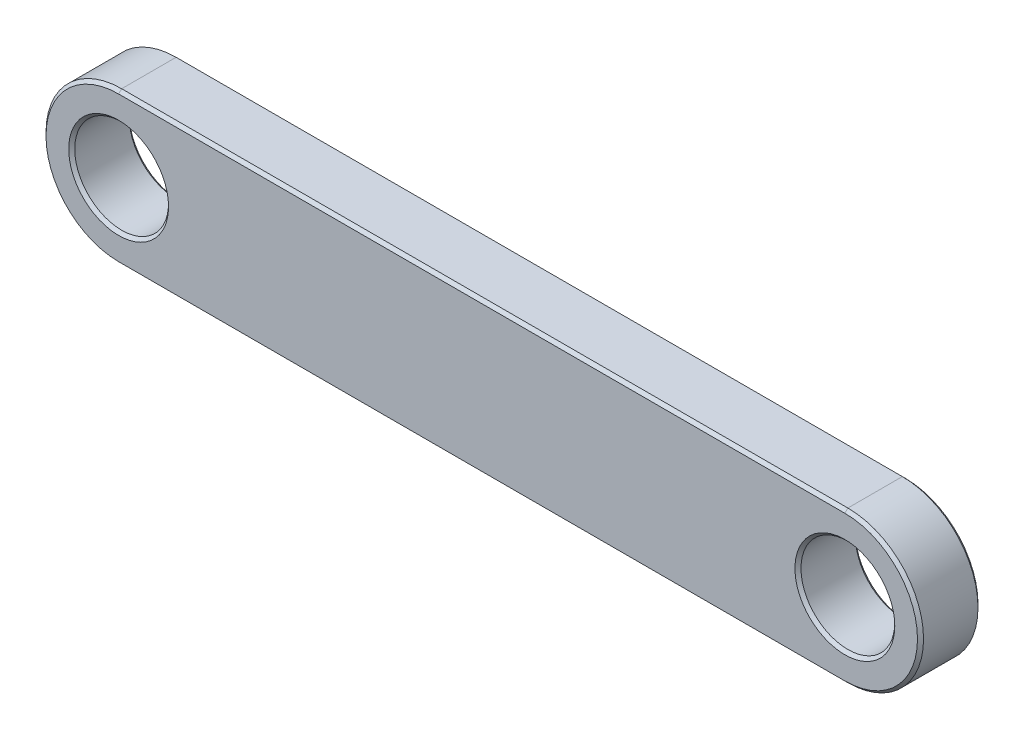
ISO-10303-21;
HEADER;
FILE_DESCRIPTION(('STEP AP214'),'2;1');
FILE_NAME('part.step','',(''),(''),'','','');
FILE_SCHEMA(('AUTOMOTIVE_DESIGN { 1 0 10303 214 1 1 1 1 }'));
ENDSEC;
DATA;
#1=APPLICATION_CONTEXT('core data for automotive mechanical design processes');
#2=APPLICATION_PROTOCOL_DEFINITION('international standard','automotive_design',2000,#1);
#3=PRODUCT_CONTEXT('',#1,'mechanical');
#4=PRODUCT('Part','Part','',(#3));
#5=PRODUCT_RELATED_PRODUCT_CATEGORY('part','',(#4));
#6=PRODUCT_DEFINITION_FORMATION('','',#4);
#7=PRODUCT_DEFINITION_CONTEXT('part definition',#1,'design');
#8=PRODUCT_DEFINITION('design','',#6,#7);
#9=PRODUCT_DEFINITION_SHAPE('','',#8);
#10=(LENGTH_UNIT() NAMED_UNIT(*) SI_UNIT(.MILLI.,.METRE.));
#11=(NAMED_UNIT(*) PLANE_ANGLE_UNIT() SI_UNIT($,.RADIAN.));
#12=(NAMED_UNIT(*) SI_UNIT($,.STERADIAN.) SOLID_ANGLE_UNIT());
#13=UNCERTAINTY_MEASURE_WITH_UNIT(LENGTH_MEASURE(1.E-05),#10,'distance_accuracy_value','');
#14=(GEOMETRIC_REPRESENTATION_CONTEXT(3) GLOBAL_UNCERTAINTY_ASSIGNED_CONTEXT((#13)) GLOBAL_UNIT_ASSIGNED_CONTEXT((#10,
#11,#12)) REPRESENTATION_CONTEXT('',''));
#15=CARTESIAN_POINT('',(0.,0.,0.));
#16=DIRECTION('',(0.,0.,1.));
#17=DIRECTION('',(1.,0.,0.));
#18=AXIS2_PLACEMENT_3D('',#15,#16,#17);
#19=CARTESIAN_POINT('',(-12.,0.,2.));
#20=DIRECTION('',(0.,0.,1.));
#21=DIRECTION('',(1.,0.,0.));
#22=AXIS2_PLACEMENT_3D('',#19,#20,#21);
#23=PLANE('',#22);
#24=CARTESIAN_POINT('',(12.,0.,2.));
#25=DIRECTION('',(0.,0.,1.));
#26=DIRECTION('',(1.,0.,0.));
#27=AXIS2_PLACEMENT_3D('',#24,#25,#26);
#28=CIRCLE('',#27,1.65);
#29=CARTESIAN_POINT('',(13.65,0.,2.));
#30=VERTEX_POINT('',#29);
#31=EDGE_CURVE('E11',#30,#30,#28,.F.);
#32=ORIENTED_EDGE('',*,*,#31,.T.);
#33=EDGE_LOOP('',(#32));
#34=FACE_BOUND('',#33,.T.);
#35=CARTESIAN_POINT('',(12.,0.,2.));
#36=DIRECTION('',(0.,0.,1.));
#37=DIRECTION('',(1.,0.,0.));
#38=AXIS2_PLACEMENT_3D('',#35,#36,#37);
#39=CIRCLE('',#38,2.4);
#40=CARTESIAN_POINT('',(12.,-2.4,2.));
#41=VERTEX_POINT('',#40);
#42=CARTESIAN_POINT('',(12.,2.4,2.));
#43=VERTEX_POINT('',#42);
#44=EDGE_CURVE('E52',#41,#43,#39,.T.);
#45=ORIENTED_EDGE('',*,*,#44,.T.);
#46=DIRECTION('',(-1.,0.,0.));
#47=VECTOR('',#46,1.);
#48=CARTESIAN_POINT('',(-12.,2.4,2.));
#49=LINE('',#48,#47);
#50=CARTESIAN_POINT('',(-12.,2.4,2.));
#51=VERTEX_POINT('',#50);
#52=EDGE_CURVE('E44',#43,#51,#49,.T.);
#53=ORIENTED_EDGE('',*,*,#52,.T.);
#54=CARTESIAN_POINT('',(-12.,0.,2.));
#55=DIRECTION('',(0.,0.,1.));
#56=DIRECTION('',(1.,0.,0.));
#57=AXIS2_PLACEMENT_3D('',#54,#55,#56);
#58=CIRCLE('',#57,2.4);
#59=CARTESIAN_POINT('',(-12.,-2.4,2.));
#60=VERTEX_POINT('',#59);
#61=EDGE_CURVE('E170',#51,#60,#58,.T.);
#62=ORIENTED_EDGE('',*,*,#61,.T.);
#63=DIRECTION('',(1.,0.,0.));
#64=VECTOR('',#63,1.);
#65=CARTESIAN_POINT('',(12.,-2.4,2.));
#66=LINE('',#65,#64);
#67=EDGE_CURVE('E57',#60,#41,#66,.T.);
#68=ORIENTED_EDGE('',*,*,#67,.T.);
#69=EDGE_LOOP('',(#45,#53,#62,#68));
#70=FACE_BOUND('',#69,.T.);
#71=CARTESIAN_POINT('',(-12.,0.,2.));
#72=DIRECTION('',(0.,0.,1.));
#73=DIRECTION('',(1.,0.,0.));
#74=AXIS2_PLACEMENT_3D('',#71,#72,#73);
#75=CIRCLE('',#74,1.65);
#76=CARTESIAN_POINT('',(-10.35,0.,2.));
#77=VERTEX_POINT('',#76);
#78=EDGE_CURVE('E167',#77,#77,#75,.F.);
#79=ORIENTED_EDGE('',*,*,#78,.T.);
#80=EDGE_LOOP('',(#79));
#81=FACE_BOUND('',#80,.T.);
#82=ADVANCED_FACE('F34',(#34,#70,#81),#23,.T.);
#83=CARTESIAN_POINT('',(-12.,0.,0.));
#84=DIRECTION('',(0.,0.,1.));
#85=DIRECTION('',(1.,0.,0.));
#86=AXIS2_PLACEMENT_3D('',#83,#84,#85);
#87=PLANE('',#86);
#88=CARTESIAN_POINT('',(12.,0.,0.));
#89=DIRECTION('',(0.,0.,1.));
#90=DIRECTION('',(1.,0.,0.));
#91=AXIS2_PLACEMENT_3D('',#88,#89,#90);
#92=CIRCLE('',#91,1.65);
#93=CARTESIAN_POINT('',(10.35,0.,0.));
#94=VERTEX_POINT('',#93);
#95=EDGE_CURVE('E132',#94,#94,#92,.T.);
#96=ORIENTED_EDGE('',*,*,#95,.T.);
#97=EDGE_LOOP('',(#96));
#98=FACE_BOUND('',#97,.T.);
#99=CARTESIAN_POINT('',(-12.,0.,0.));
#100=DIRECTION('',(0.,0.,1.));
#101=DIRECTION('',(1.,0.,0.));
#102=AXIS2_PLACEMENT_3D('',#99,#100,#101);
#103=CIRCLE('',#102,1.65);
#104=CARTESIAN_POINT('',(-13.65,0.,0.));
#105=VERTEX_POINT('',#104);
#106=EDGE_CURVE('E129',#105,#105,#103,.T.);
#107=ORIENTED_EDGE('',*,*,#106,.T.);
#108=EDGE_LOOP('',(#107));
#109=FACE_BOUND('',#108,.T.);
#110=CARTESIAN_POINT('',(12.,0.,0.));
#111=DIRECTION('',(0.,0.,1.));
#112=DIRECTION('',(1.,0.,0.));
#113=AXIS2_PLACEMENT_3D('',#110,#111,#112);
#114=CIRCLE('',#113,2.4);
#115=CARTESIAN_POINT('',(12.,2.4,0.));
#116=VERTEX_POINT('',#115);
#117=CARTESIAN_POINT('',(12.,-2.4,0.));
#118=VERTEX_POINT('',#117);
#119=EDGE_CURVE('E128',#116,#118,#114,.F.);
#120=ORIENTED_EDGE('',*,*,#119,.T.);
#121=DIRECTION('',(-1.,0.,0.));
#122=VECTOR('',#121,1.);
#123=CARTESIAN_POINT('',(-12.,-2.4,0.));
#124=LINE('',#123,#122);
#125=CARTESIAN_POINT('',(-12.,-2.4,0.));
#126=VERTEX_POINT('',#125);
#127=EDGE_CURVE('E107',#118,#126,#124,.T.);
#128=ORIENTED_EDGE('',*,*,#127,.T.);
#129=CARTESIAN_POINT('',(-12.,0.,0.));
#130=DIRECTION('',(0.,0.,1.));
#131=DIRECTION('',(1.,0.,0.));
#132=AXIS2_PLACEMENT_3D('',#129,#130,#131);
#133=CIRCLE('',#132,2.4);
#134=CARTESIAN_POINT('',(-12.,2.4,0.));
#135=VERTEX_POINT('',#134);
#136=EDGE_CURVE('E117',#126,#135,#133,.F.);
#137=ORIENTED_EDGE('',*,*,#136,.T.);
#138=DIRECTION('',(1.,0.,0.));
#139=VECTOR('',#138,1.);
#140=CARTESIAN_POINT('',(-12.,2.4,0.));
#141=LINE('',#140,#139);
#142=EDGE_CURVE('E123',#135,#116,#141,.T.);
#143=ORIENTED_EDGE('',*,*,#142,.T.);
#144=EDGE_LOOP('',(#120,#128,#137,#143));
#145=FACE_BOUND('',#144,.T.);
#146=ADVANCED_FACE('F126',(#98,#109,#145),#87,.F.);
#147=CARTESIAN_POINT('',(-12.,0.,2.));
#148=DIRECTION('',(0.,0.,-1.));
#149=DIRECTION('',(-1.,0.,0.));
#150=AXIS2_PLACEMENT_3D('',#147,#148,#149);
#151=CYLINDRICAL_SURFACE('',#150,2.5);
#152=DIRECTION('',(0.,0.,-1.));
#153=VECTOR('',#152,1.);
#154=CARTESIAN_POINT('',(-12.,2.5,2.));
#155=LINE('',#154,#153);
#156=CARTESIAN_POINT('',(-12.,2.5,1.9));
#157=VERTEX_POINT('',#156);
#158=CARTESIAN_POINT('',(-12.,2.5,0.1));
#159=VERTEX_POINT('',#158);
#160=EDGE_CURVE('E179',#157,#159,#155,.T.);
#161=ORIENTED_EDGE('',*,*,#160,.T.);
#162=CARTESIAN_POINT('',(-12.,0.,0.1));
#163=DIRECTION('',(0.,0.,1.));
#164=DIRECTION('',(1.,0.,0.));
#165=AXIS2_PLACEMENT_3D('',#162,#163,#164);
#166=CIRCLE('',#165,2.5);
#167=CARTESIAN_POINT('',(-12.,-2.5,0.1));
#168=VERTEX_POINT('',#167);
#169=EDGE_CURVE('E165',#159,#168,#166,.T.);
#170=ORIENTED_EDGE('',*,*,#169,.T.);
#171=DIRECTION('',(0.,0.,-1.));
#172=VECTOR('',#171,1.);
#173=CARTESIAN_POINT('',(-12.,-2.5,2.));
#174=LINE('',#173,#172);
#175=CARTESIAN_POINT('',(-12.,-2.5,1.9));
#176=VERTEX_POINT('',#175);
#177=EDGE_CURVE('E124',#176,#168,#174,.T.);
#178=ORIENTED_EDGE('',*,*,#177,.F.);
#179=CARTESIAN_POINT('',(-12.,0.,1.9));
#180=DIRECTION('',(0.,0.,1.));
#181=DIRECTION('',(1.,0.,0.));
#182=AXIS2_PLACEMENT_3D('',#179,#180,#181);
#183=CIRCLE('',#182,2.5);
#184=EDGE_CURVE('E163',#176,#157,#183,.F.);
#185=ORIENTED_EDGE('',*,*,#184,.T.);
#186=EDGE_LOOP('',(#161,#170,#178,#185));
#187=FACE_BOUND('',#186,.T.);
#188=ADVANCED_FACE('F205',(#187),#151,.T.);
#189=CARTESIAN_POINT('',(-12.,-2.5,2.));
#190=DIRECTION('',(0.,1.,0.));
#191=DIRECTION('',(-1.,0.,0.));
#192=AXIS2_PLACEMENT_3D('',#189,#190,#191);
#193=PLANE('',#192);
#194=ORIENTED_EDGE('',*,*,#177,.T.);
#195=DIRECTION('',(1.,0.,0.));
#196=VECTOR('',#195,1.);
#197=CARTESIAN_POINT('',(-12.,-2.5,0.1));
#198=LINE('',#197,#196);
#199=CARTESIAN_POINT('',(12.,-2.5,0.1));
#200=VERTEX_POINT('',#199);
#201=EDGE_CURVE('E110',#168,#200,#198,.T.);
#202=ORIENTED_EDGE('',*,*,#201,.T.);
#203=DIRECTION('',(0.,0.,-1.));
#204=VECTOR('',#203,1.);
#205=CARTESIAN_POINT('',(12.,-2.5,2.));
#206=LINE('',#205,#204);
#207=CARTESIAN_POINT('',(12.,-2.5,1.9));
#208=VERTEX_POINT('',#207);
#209=EDGE_CURVE('E202',#208,#200,#206,.T.);
#210=ORIENTED_EDGE('',*,*,#209,.F.);
#211=DIRECTION('',(-1.,0.,0.));
#212=VECTOR('',#211,1.);
#213=CARTESIAN_POINT('',(-12.,-2.5,1.9));
#214=LINE('',#213,#212);
#215=EDGE_CURVE('E151',#208,#176,#214,.T.);
#216=ORIENTED_EDGE('',*,*,#215,.T.);
#217=EDGE_LOOP('',(#194,#202,#210,#216));
#218=FACE_BOUND('',#217,.T.);
#219=ADVANCED_FACE('F200',(#218),#193,.F.);
#220=CARTESIAN_POINT('',(12.,0.,2.));
#221=DIRECTION('',(0.,0.,-1.));
#222=DIRECTION('',(-1.,0.,0.));
#223=AXIS2_PLACEMENT_3D('',#220,#221,#222);
#224=CYLINDRICAL_SURFACE('',#223,2.5);
#225=ORIENTED_EDGE('',*,*,#209,.T.);
#226=CARTESIAN_POINT('',(12.,0.,0.1));
#227=DIRECTION('',(0.,0.,1.));
#228=DIRECTION('',(1.,0.,0.));
#229=AXIS2_PLACEMENT_3D('',#226,#227,#228);
#230=CIRCLE('',#229,2.5);
#231=CARTESIAN_POINT('',(12.,2.50000000000001,0.1));
#232=VERTEX_POINT('',#231);
#233=EDGE_CURVE('E156',#200,#232,#230,.T.);
#234=ORIENTED_EDGE('',*,*,#233,.T.);
#235=DIRECTION('',(0.,0.,-1.));
#236=VECTOR('',#235,1.);
#237=CARTESIAN_POINT('',(12.,2.50000000000001,2.));
#238=LINE('',#237,#236);
#239=CARTESIAN_POINT('',(12.,2.50000000000001,1.9));
#240=VERTEX_POINT('',#239);
#241=EDGE_CURVE('E208',#240,#232,#238,.T.);
#242=ORIENTED_EDGE('',*,*,#241,.F.);
#243=CARTESIAN_POINT('',(12.,0.,1.9));
#244=DIRECTION('',(0.,0.,1.));
#245=DIRECTION('',(1.,0.,0.));
#246=AXIS2_PLACEMENT_3D('',#243,#244,#245);
#247=CIRCLE('',#246,2.5);
#248=EDGE_CURVE('E154',#240,#208,#247,.F.);
#249=ORIENTED_EDGE('',*,*,#248,.T.);
#250=EDGE_LOOP('',(#225,#234,#242,#249));
#251=FACE_BOUND('',#250,.T.);
#252=ADVANCED_FACE('F221',(#251),#224,.T.);
#253=CARTESIAN_POINT('',(-12.,2.5,2.));
#254=DIRECTION('',(0.,-1.,0.));
#255=DIRECTION('',(1.,0.,0.));
#256=AXIS2_PLACEMENT_3D('',#253,#254,#255);
#257=PLANE('',#256);
#258=ORIENTED_EDGE('',*,*,#241,.T.);
#259=DIRECTION('',(-1.,0.,0.));
#260=VECTOR('',#259,1.);
#261=CARTESIAN_POINT('',(-12.,2.5,0.1));
#262=LINE('',#261,#260);
#263=EDGE_CURVE('E161',#232,#159,#262,.T.);
#264=ORIENTED_EDGE('',*,*,#263,.T.);
#265=ORIENTED_EDGE('',*,*,#160,.F.);
#266=DIRECTION('',(1.,0.,0.));
#267=VECTOR('',#266,1.);
#268=CARTESIAN_POINT('',(12.,2.50000000000001,1.9));
#269=LINE('',#268,#267);
#270=EDGE_CURVE('E158',#157,#240,#269,.T.);
#271=ORIENTED_EDGE('',*,*,#270,.T.);
#272=EDGE_LOOP('',(#258,#264,#265,#271));
#273=FACE_BOUND('',#272,.T.);
#274=ADVANCED_FACE('F225',(#273),#257,.F.);
#275=CARTESIAN_POINT('',(-12.,0.,2.));
#276=DIRECTION('',(0.,0.,-1.));
#277=DIRECTION('',(-1.,0.,0.));
#278=AXIS2_PLACEMENT_3D('',#275,#276,#277);
#279=CYLINDRICAL_SURFACE('',#278,1.55);
#280=CARTESIAN_POINT('',(-12.,0.,0.0999999999999942));
#281=DIRECTION('',(0.,0.,1.));
#282=DIRECTION('',(1.,0.,0.));
#283=AXIS2_PLACEMENT_3D('',#280,#281,#282);
#284=CIRCLE('',#283,1.55);
#285=CARTESIAN_POINT('',(-13.55,0.,0.0999999999999942));
#286=VERTEX_POINT('',#285);
#287=EDGE_CURVE('E148',#286,#286,#284,.F.);
#288=ORIENTED_EDGE('',*,*,#287,.T.);
#289=EDGE_LOOP('',(#288));
#290=FACE_BOUND('',#289,.T.);
#291=CARTESIAN_POINT('',(-12.,0.,1.90000000000001));
#292=DIRECTION('',(0.,0.,1.));
#293=DIRECTION('',(1.,0.,0.));
#294=AXIS2_PLACEMENT_3D('',#291,#292,#293);
#295=CIRCLE('',#294,1.55);
#296=CARTESIAN_POINT('',(-10.45,0.,1.90000000000001));
#297=VERTEX_POINT('',#296);
#298=EDGE_CURVE('E145',#297,#297,#295,.T.);
#299=ORIENTED_EDGE('',*,*,#298,.T.);
#300=EDGE_LOOP('',(#299));
#301=FACE_BOUND('',#300,.T.);
#302=ADVANCED_FACE('F241',(#290,#301),#279,.F.);
#303=CARTESIAN_POINT('',(12.,0.,2.));
#304=DIRECTION('',(0.,0.,-1.));
#305=DIRECTION('',(-1.,0.,0.));
#306=AXIS2_PLACEMENT_3D('',#303,#304,#305);
#307=CYLINDRICAL_SURFACE('',#306,1.55);
#308=CARTESIAN_POINT('',(12.,0.,0.0999999999999942));
#309=DIRECTION('',(0.,0.,1.));
#310=DIRECTION('',(1.,0.,0.));
#311=AXIS2_PLACEMENT_3D('',#308,#309,#310);
#312=CIRCLE('',#311,1.55);
#313=CARTESIAN_POINT('',(10.45,0.,0.0999999999999942));
#314=VERTEX_POINT('',#313);
#315=EDGE_CURVE('E142',#314,#314,#312,.F.);
#316=ORIENTED_EDGE('',*,*,#315,.T.);
#317=EDGE_LOOP('',(#316));
#318=FACE_BOUND('',#317,.T.);
#319=CARTESIAN_POINT('',(12.,0.,1.9));
#320=DIRECTION('',(0.,0.,1.));
#321=DIRECTION('',(1.,0.,0.));
#322=AXIS2_PLACEMENT_3D('',#319,#320,#321);
#323=CIRCLE('',#322,1.55);
#324=CARTESIAN_POINT('',(13.55,0.,1.9));
#325=VERTEX_POINT('',#324);
#326=EDGE_CURVE('E139',#325,#325,#323,.T.);
#327=ORIENTED_EDGE('',*,*,#326,.T.);
#328=EDGE_LOOP('',(#327));
#329=FACE_BOUND('',#328,.T.);
#330=ADVANCED_FACE('F243',(#318,#329),#307,.F.);
#331=CARTESIAN_POINT('',(12.,0.,0.));
#332=DIRECTION('',(0.,0.,-1.));
#333=DIRECTION('',(-1.,0.,0.));
#334=AXIS2_PLACEMENT_3D('',#331,#332,#333);
#335=CONICAL_SURFACE('',#334,1.65,0.785398163397456);
#336=CARTESIAN_POINT('',(10.45,0.,0.0999999999999942));
#337=CARTESIAN_POINT('',(10.4489583333333,0.,0.0989583333333275));
#338=CARTESIAN_POINT('',(10.4479166666667,0.,0.0979166666666609));
#339=CARTESIAN_POINT('',(10.4458333333333,0.,0.0958333333333278));
#340=CARTESIAN_POINT('',(10.4447916666667,0.,0.0947916666666612));
#341=CARTESIAN_POINT('',(10.4427083333333,0.,0.0927083333333279));
#342=CARTESIAN_POINT('',(10.4416666666667,0.,0.0916666666666611));
#343=CARTESIAN_POINT('',(10.4395833333333,0.,0.089583333333328));
#344=CARTESIAN_POINT('',(10.4385416666667,0.,0.0885416666666616));
#345=CARTESIAN_POINT('',(10.4364583333333,0.,0.0864583333333285));
#346=CARTESIAN_POINT('',(10.4354166666667,0.,0.0854166666666617));
#347=CARTESIAN_POINT('',(10.4333333333333,0.,0.0833333333333284));
#348=CARTESIAN_POINT('',(10.4322916666667,0.,0.0822916666666619));
#349=CARTESIAN_POINT('',(10.4302083333333,0.,0.0802083333333287));
#350=CARTESIAN_POINT('',(10.4291666666667,0.,0.0791666666666621));
#351=CARTESIAN_POINT('',(10.4270833333333,0.,0.0770833333333288));
#352=CARTESIAN_POINT('',(10.4260416666667,0.,0.0760416666666622));
#353=CARTESIAN_POINT('',(10.4239583333333,0.,0.073958333333329));
#354=CARTESIAN_POINT('',(10.4229166666667,0.,0.0729166666666625));
#355=CARTESIAN_POINT('',(10.4208333333333,0.,0.0708333333333292));
#356=CARTESIAN_POINT('',(10.4197916666667,0.,0.0697916666666624));
#357=CARTESIAN_POINT('',(10.4177083333333,0.,0.0677083333333293));
#358=CARTESIAN_POINT('',(10.4166666666667,0.,0.0666666666666629));
#359=CARTESIAN_POINT('',(10.4145833333333,0.,0.0645833333333297));
#360=CARTESIAN_POINT('',(10.4135416666667,0.,0.063541666666663));
#361=CARTESIAN_POINT('',(10.4114583333333,0.,0.0614583333333297));
#362=CARTESIAN_POINT('',(10.4104166666667,0.,0.0604166666666631));
#363=CARTESIAN_POINT('',(10.4083333333333,0.,0.0583333333333299));
#364=CARTESIAN_POINT('',(10.4072916666667,0.,0.0572916666666633));
#365=CARTESIAN_POINT('',(10.4052083333333,0.,0.0552083333333301));
#366=CARTESIAN_POINT('',(10.4041666666667,0.,0.0541666666666635));
#367=CARTESIAN_POINT('',(10.4020833333333,0.,0.0520833333333303));
#368=CARTESIAN_POINT('',(10.4010416666667,0.,0.0510416666666637));
#369=CARTESIAN_POINT('',(10.3989583333333,0.,0.0489583333333305));
#370=CARTESIAN_POINT('',(10.3979166666667,0.,0.0479166666666639));
#371=CARTESIAN_POINT('',(10.3958333333333,0.,0.0458333333333307));
#372=CARTESIAN_POINT('',(10.3947916666667,0.,0.044791666666664));
#373=CARTESIAN_POINT('',(10.3927083333333,0.,0.0427083333333309));
#374=CARTESIAN_POINT('',(10.3916666666667,0.,0.0416666666666643));
#375=CARTESIAN_POINT('',(10.3895833333333,0.,0.039583333333331));
#376=CARTESIAN_POINT('',(10.3885416666667,0.,0.0385416666666642));
#377=CARTESIAN_POINT('',(10.3864583333333,0.,0.0364583333333311));
#378=CARTESIAN_POINT('',(10.3854166666667,0.,0.0354166666666647));
#379=CARTESIAN_POINT('',(10.3833333333333,0.,0.0333333333333316));
#380=CARTESIAN_POINT('',(10.3822916666667,0.,0.0322916666666648));
#381=CARTESIAN_POINT('',(10.3802083333333,0.,0.0302083333333315));
#382=CARTESIAN_POINT('',(10.3791666666667,0.,0.029166666666665));
#383=CARTESIAN_POINT('',(10.3770833333333,0.,0.0270833333333318));
#384=CARTESIAN_POINT('',(10.3760416666667,0.,0.0260416666666652));
#385=CARTESIAN_POINT('',(10.3739583333333,0.,0.0239583333333319));
#386=CARTESIAN_POINT('',(10.3729166666667,0.,0.0229166666666653));
#387=CARTESIAN_POINT('',(10.3708333333333,0.,0.0208333333333321));
#388=CARTESIAN_POINT('',(10.3697916666667,0.,0.0197916666666656));
#389=CARTESIAN_POINT('',(10.3677083333333,0.,0.0177083333333323));
#390=CARTESIAN_POINT('',(10.3666666666667,0.,0.0166666666666655));
#391=CARTESIAN_POINT('',(10.3645833333333,0.,0.0145833333333324));
#392=CARTESIAN_POINT('',(10.3635416666667,0.,0.013541666666666));
#393=CARTESIAN_POINT('',(10.3614583333333,0.,0.0114583333333328));
#394=CARTESIAN_POINT('',(10.3604166666667,0.,0.0104166666666661));
#395=CARTESIAN_POINT('',(10.3583333333333,0.,0.0083333333333328));
#396=CARTESIAN_POINT('',(10.3572916666667,0.,0.00729166666666623));
#397=CARTESIAN_POINT('',(10.3552083333333,0.,0.00520833333333304));
#398=CARTESIAN_POINT('',(10.3541666666667,0.,0.00416666666666643));
#399=CARTESIAN_POINT('',(10.3520833333333,0.,0.00208333333333321));
#400=CARTESIAN_POINT('',(10.3510416666667,0.,0.00104166666666659));
#401=CARTESIAN_POINT('',(10.35,0.,0.));
#402=B_SPLINE_CURVE_WITH_KNOTS('',3,(#336,#337,#338,#339,#340,#341,#342,#343,#344,#345,#346,
#347,#348,#349,#350,#351,#352,#353,#354,#355,#356,#357,#358,#359,#360,#361,#362,#363,#364,#365,
#366,#367,#368,#369,#370,#371,#372,#373,#374,#375,#376,#377,#378,#379,#380,#381,#382,#383,#384,
#385,#386,#387,#388,#389,#390,#391,#392,#393,#394,#395,#396,#397,#398,#399,#400,#401),
.UNSPECIFIED.,.F.,.F.,(4,2,2,2,2,2,2,2,2,2,2,2,2,2,2,2,2,2,2,2,2,2,2,2,2,2,2,2,2,2,2,2,4),(0.,
0.00441941738241555,0.0088388347648311,0.0132582521472467,0.0176776695296634,0.022097086912079,
0.0265165042944945,0.0309359216769101,0.0353553390593256,0.0397747564417412,0.0441941738241567,
0.0486135912065735,0.053033008588989,0.0574524259714046,0.0618718433538201,0.0662912607362357,
0.0707106781186512,0.0751300955010668,0.0795495128834823,0.0839689302658979,0.0883883476483134,
0.0928077650307302,0.0972271824131457,0.101646599795561,0.106066017177977,0.110485434560392,
0.114904851942808,0.119324269325223,0.12374368670764,0.128163104090056,0.132582521472471,
0.137001938854887,0.141421356237302),.UNSPECIFIED.);
#403=EDGE_CURVE('BSEAM250',#314,#94,#402,.T.);
#404=ORIENTED_EDGE('',*,*,#315,.F.);
#405=ORIENTED_EDGE('',*,*,#95,.F.);
#406=ORIENTED_EDGE('',*,*,#403,.T.);
#407=ORIENTED_EDGE('',*,*,#403,.F.);
#408=EDGE_LOOP('',(#404,#406,#405,#407));
#409=FACE_BOUND('',#408,.T.);
#410=ADVANCED_FACE('F250',(#409),#335,.F.);
#411=CARTESIAN_POINT('',(-12.,0.,0.));
#412=DIRECTION('',(0.,0.,-1.));
#413=DIRECTION('',(-1.,0.,0.));
#414=AXIS2_PLACEMENT_3D('',#411,#412,#413);
#415=CONICAL_SURFACE('',#414,1.65,0.785398163397456);
#416=CARTESIAN_POINT('',(-13.55,0.,0.0999999999999942));
#417=CARTESIAN_POINT('',(-13.5510416666667,0.,0.0989583333333275));
#418=CARTESIAN_POINT('',(-13.5520833333333,0.,0.0979166666666609));
#419=CARTESIAN_POINT('',(-13.5541666666667,0.,0.0958333333333278));
#420=CARTESIAN_POINT('',(-13.5552083333333,0.,0.0947916666666612));
#421=CARTESIAN_POINT('',(-13.5572916666667,0.,0.0927083333333279));
#422=CARTESIAN_POINT('',(-13.5583333333333,0.,0.0916666666666611));
#423=CARTESIAN_POINT('',(-13.5604166666667,0.,0.089583333333328));
#424=CARTESIAN_POINT('',(-13.5614583333333,0.,0.0885416666666616));
#425=CARTESIAN_POINT('',(-13.5635416666667,0.,0.0864583333333285));
#426=CARTESIAN_POINT('',(-13.5645833333333,0.,0.0854166666666617));
#427=CARTESIAN_POINT('',(-13.5666666666667,0.,0.0833333333333284));
#428=CARTESIAN_POINT('',(-13.5677083333333,0.,0.0822916666666619));
#429=CARTESIAN_POINT('',(-13.5697916666667,0.,0.0802083333333287));
#430=CARTESIAN_POINT('',(-13.5708333333333,0.,0.0791666666666621));
#431=CARTESIAN_POINT('',(-13.5729166666667,0.,0.0770833333333288));
#432=CARTESIAN_POINT('',(-13.5739583333333,0.,0.0760416666666622));
#433=CARTESIAN_POINT('',(-13.5760416666667,0.,0.073958333333329));
#434=CARTESIAN_POINT('',(-13.5770833333333,0.,0.0729166666666625));
#435=CARTESIAN_POINT('',(-13.5791666666667,0.,0.0708333333333292));
#436=CARTESIAN_POINT('',(-13.5802083333333,0.,0.0697916666666624));
#437=CARTESIAN_POINT('',(-13.5822916666667,0.,0.0677083333333293));
#438=CARTESIAN_POINT('',(-13.5833333333333,0.,0.0666666666666629));
#439=CARTESIAN_POINT('',(-13.5854166666667,0.,0.0645833333333297));
#440=CARTESIAN_POINT('',(-13.5864583333333,0.,0.063541666666663));
#441=CARTESIAN_POINT('',(-13.5885416666667,0.,0.0614583333333297));
#442=CARTESIAN_POINT('',(-13.5895833333333,0.,0.0604166666666631));
#443=CARTESIAN_POINT('',(-13.5916666666667,0.,0.0583333333333299));
#444=CARTESIAN_POINT('',(-13.5927083333333,0.,0.0572916666666633));
#445=CARTESIAN_POINT('',(-13.5947916666667,0.,0.0552083333333301));
#446=CARTESIAN_POINT('',(-13.5958333333333,0.,0.0541666666666635));
#447=CARTESIAN_POINT('',(-13.5979166666667,0.,0.0520833333333303));
#448=CARTESIAN_POINT('',(-13.5989583333333,0.,0.0510416666666637));
#449=CARTESIAN_POINT('',(-13.6010416666667,0.,0.0489583333333305));
#450=CARTESIAN_POINT('',(-13.6020833333333,0.,0.0479166666666639));
#451=CARTESIAN_POINT('',(-13.6041666666667,0.,0.0458333333333307));
#452=CARTESIAN_POINT('',(-13.6052083333333,0.,0.044791666666664));
#453=CARTESIAN_POINT('',(-13.6072916666667,0.,0.0427083333333309));
#454=CARTESIAN_POINT('',(-13.6083333333333,0.,0.0416666666666643));
#455=CARTESIAN_POINT('',(-13.6104166666667,0.,0.039583333333331));
#456=CARTESIAN_POINT('',(-13.6114583333333,0.,0.0385416666666642));
#457=CARTESIAN_POINT('',(-13.6135416666667,0.,0.0364583333333311));
#458=CARTESIAN_POINT('',(-13.6145833333333,0.,0.0354166666666647));
#459=CARTESIAN_POINT('',(-13.6166666666667,0.,0.0333333333333316));
#460=CARTESIAN_POINT('',(-13.6177083333333,0.,0.0322916666666648));
#461=CARTESIAN_POINT('',(-13.6197916666667,0.,0.0302083333333315));
#462=CARTESIAN_POINT('',(-13.6208333333333,0.,0.029166666666665));
#463=CARTESIAN_POINT('',(-13.6229166666667,0.,0.0270833333333318));
#464=CARTESIAN_POINT('',(-13.6239583333333,0.,0.0260416666666652));
#465=CARTESIAN_POINT('',(-13.6260416666667,0.,0.0239583333333319));
#466=CARTESIAN_POINT('',(-13.6270833333333,0.,0.0229166666666653));
#467=CARTESIAN_POINT('',(-13.6291666666667,0.,0.0208333333333321));
#468=CARTESIAN_POINT('',(-13.6302083333333,0.,0.0197916666666656));
#469=CARTESIAN_POINT('',(-13.6322916666667,0.,0.0177083333333323));
#470=CARTESIAN_POINT('',(-13.6333333333333,0.,0.0166666666666655));
#471=CARTESIAN_POINT('',(-13.6354166666667,0.,0.0145833333333324));
#472=CARTESIAN_POINT('',(-13.6364583333333,0.,0.013541666666666));
#473=CARTESIAN_POINT('',(-13.6385416666667,0.,0.0114583333333328));
#474=CARTESIAN_POINT('',(-13.6395833333333,0.,0.0104166666666661));
#475=CARTESIAN_POINT('',(-13.6416666666667,0.,0.0083333333333328));
#476=CARTESIAN_POINT('',(-13.6427083333333,0.,0.00729166666666623));
#477=CARTESIAN_POINT('',(-13.6447916666667,0.,0.00520833333333304));
#478=CARTESIAN_POINT('',(-13.6458333333333,0.,0.00416666666666643));
#479=CARTESIAN_POINT('',(-13.6479166666667,0.,0.00208333333333321));
#480=CARTESIAN_POINT('',(-13.6489583333333,0.,0.00104166666666659));
#481=CARTESIAN_POINT('',(-13.65,0.,0.));
#482=B_SPLINE_CURVE_WITH_KNOTS('',3,(#416,#417,#418,#419,#420,#421,#422,#423,#424,#425,#426,
#427,#428,#429,#430,#431,#432,#433,#434,#435,#436,#437,#438,#439,#440,#441,#442,#443,#444,#445,
#446,#447,#448,#449,#450,#451,#452,#453,#454,#455,#456,#457,#458,#459,#460,#461,#462,#463,#464,
#465,#466,#467,#468,#469,#470,#471,#472,#473,#474,#475,#476,#477,#478,#479,#480,#481),
.UNSPECIFIED.,.F.,.F.,(4,2,2,2,2,2,2,2,2,2,2,2,2,2,2,2,2,2,2,2,2,2,2,2,2,2,2,2,2,2,2,2,4),(0.,
0.00441941738241555,0.0088388347648311,0.0132582521472467,0.0176776695296634,0.022097086912079,
0.0265165042944945,0.0309359216769101,0.0353553390593256,0.0397747564417412,0.0441941738241567,
0.0486135912065735,0.053033008588989,0.0574524259714046,0.0618718433538201,0.0662912607362357,
0.0707106781186512,0.0751300955010668,0.0795495128834823,0.0839689302658979,0.0883883476483134,
0.0928077650307302,0.0972271824131457,0.101646599795561,0.106066017177977,0.110485434560392,
0.114904851942808,0.119324269325223,0.12374368670764,0.128163104090056,0.132582521472471,
0.137001938854887,0.141421356237302),.UNSPECIFIED.);
#483=EDGE_CURVE('BSEAM270',#286,#105,#482,.T.);
#484=ORIENTED_EDGE('',*,*,#287,.F.);
#485=ORIENTED_EDGE('',*,*,#106,.F.);
#486=ORIENTED_EDGE('',*,*,#483,.T.);
#487=ORIENTED_EDGE('',*,*,#483,.F.);
#488=EDGE_LOOP('',(#484,#486,#485,#487));
#489=FACE_BOUND('',#488,.T.);
#490=ADVANCED_FACE('F270',(#489),#415,.F.);
#491=CARTESIAN_POINT('',(-12.,2.5,0.1));
#492=DIRECTION('',(0.,-0.707106781186526,0.707106781186569));
#493=DIRECTION('',(-1.,0.,0.));
#494=AXIS2_PLACEMENT_3D('',#491,#492,#493);
#495=PLANE('',#494);
#496=DIRECTION('',(0.,0.707106781186569,0.707106781186526));
#497=VECTOR('',#496,1.);
#498=CARTESIAN_POINT('',(12.,2.4,0.));
#499=LINE('',#498,#497);
#500=EDGE_CURVE('E113',#116,#232,#499,.T.);
#501=ORIENTED_EDGE('',*,*,#500,.F.);
#502=ORIENTED_EDGE('',*,*,#142,.F.);
#503=DIRECTION('',(0.,-0.707106781186569,-0.707106781186526));
#504=VECTOR('',#503,1.);
#505=CARTESIAN_POINT('',(-12.,2.5,0.1));
#506=LINE('',#505,#504);
#507=EDGE_CURVE('E120',#159,#135,#506,.T.);
#508=ORIENTED_EDGE('',*,*,#507,.F.);
#509=ORIENTED_EDGE('',*,*,#263,.F.);
#510=EDGE_LOOP('',(#501,#502,#508,#509));
#511=FACE_BOUND('',#510,.T.);
#512=ADVANCED_FACE('F214',(#511),#495,.F.);
#513=CARTESIAN_POINT('',(-12.,0.,0.1));
#514=DIRECTION('',(0.,0.,1.));
#515=DIRECTION('',(1.,0.,0.));
#516=AXIS2_PLACEMENT_3D('',#513,#514,#515);
#517=CONICAL_SURFACE('',#516,2.5,0.785398163397479);
#518=ORIENTED_EDGE('',*,*,#507,.T.);
#519=ORIENTED_EDGE('',*,*,#136,.F.);
#520=DIRECTION('',(0.,0.707106781186569,-0.707106781186526));
#521=VECTOR('',#520,1.);
#522=CARTESIAN_POINT('',(-12.,-2.5,0.1));
#523=LINE('',#522,#521);
#524=EDGE_CURVE('E103',#168,#126,#523,.T.);
#525=ORIENTED_EDGE('',*,*,#524,.F.);
#526=ORIENTED_EDGE('',*,*,#169,.F.);
#527=EDGE_LOOP('',(#518,#519,#525,#526));
#528=FACE_BOUND('',#527,.T.);
#529=ADVANCED_FACE('F118',(#528),#517,.T.);
#530=CARTESIAN_POINT('',(12.,0.,0.1));
#531=DIRECTION('',(0.,0.,1.));
#532=DIRECTION('',(1.,0.,0.));
#533=AXIS2_PLACEMENT_3D('',#530,#531,#532);
#534=CONICAL_SURFACE('',#533,2.5,0.785398163397479);
#535=ORIENTED_EDGE('',*,*,#500,.T.);
#536=ORIENTED_EDGE('',*,*,#233,.F.);
#537=DIRECTION('',(0.,-0.707106781186569,0.707106781186526));
#538=VECTOR('',#537,1.);
#539=CARTESIAN_POINT('',(12.,-2.4,0.));
#540=LINE('',#539,#538);
#541=EDGE_CURVE('E114',#118,#200,#540,.T.);
#542=ORIENTED_EDGE('',*,*,#541,.F.);
#543=ORIENTED_EDGE('',*,*,#119,.F.);
#544=EDGE_LOOP('',(#535,#536,#542,#543));
#545=FACE_BOUND('',#544,.T.);
#546=ADVANCED_FACE('F217',(#545),#534,.T.);
#547=CARTESIAN_POINT('',(-12.,-2.5,0.1));
#548=DIRECTION('',(0.,0.707106781186526,0.707106781186569));
#549=DIRECTION('',(1.,0.,0.));
#550=AXIS2_PLACEMENT_3D('',#547,#548,#549);
#551=PLANE('',#550);
#552=ORIENTED_EDGE('',*,*,#524,.T.);
#553=ORIENTED_EDGE('',*,*,#127,.F.);
#554=ORIENTED_EDGE('',*,*,#541,.T.);
#555=ORIENTED_EDGE('',*,*,#201,.F.);
#556=EDGE_LOOP('',(#552,#553,#554,#555));
#557=FACE_BOUND('',#556,.T.);
#558=ADVANCED_FACE('F105',(#557),#551,.F.);
#559=CARTESIAN_POINT('',(12.,0.,1.9));
#560=DIRECTION('',(0.,0.,1.));
#561=DIRECTION('',(1.,0.,0.));
#562=AXIS2_PLACEMENT_3D('',#559,#560,#561);
#563=CONICAL_SURFACE('',#562,1.55,0.785398163397442);
#564=ORIENTED_EDGE('',*,*,#31,.F.);
#565=EDGE_LOOP('',(#564));
#566=FACE_BOUND('',#565,.T.);
#567=ORIENTED_EDGE('',*,*,#326,.F.);
#568=EDGE_LOOP('',(#567));
#569=FACE_BOUND('',#568,.T.);
#570=ADVANCED_FACE('F285',(#566,#569),#563,.F.);
#571=CARTESIAN_POINT('',(-12.,-2.4,2.));
#572=DIRECTION('',(0.,-0.707106781186551,0.707106781186544));
#573=DIRECTION('',(-1.,0.,0.));
#574=AXIS2_PLACEMENT_3D('',#571,#572,#573);
#575=PLANE('',#574);
#576=DIRECTION('',(0.,0.707106781186544,0.707106781186551));
#577=VECTOR('',#576,1.);
#578=CARTESIAN_POINT('',(-12.,-2.5,1.9));
#579=LINE('',#578,#577);
#580=EDGE_CURVE('E183',#176,#60,#579,.T.);
#581=ORIENTED_EDGE('',*,*,#580,.F.);
#582=ORIENTED_EDGE('',*,*,#215,.F.);
#583=DIRECTION('',(0.,-0.707106781186544,-0.707106781186551));
#584=VECTOR('',#583,1.);
#585=CARTESIAN_POINT('',(12.,-2.4,2.));
#586=LINE('',#585,#584);
#587=EDGE_CURVE('E39',#41,#208,#586,.T.);
#588=ORIENTED_EDGE('',*,*,#587,.F.);
#589=ORIENTED_EDGE('',*,*,#67,.F.);
#590=EDGE_LOOP('',(#581,#582,#588,#589));
#591=FACE_BOUND('',#590,.T.);
#592=ADVANCED_FACE('F195',(#591),#575,.T.);
#593=CARTESIAN_POINT('',(12.,0.,2.));
#594=DIRECTION('',(0.,0.,-1.));
#595=DIRECTION('',(-1.,0.,0.));
#596=AXIS2_PLACEMENT_3D('',#593,#594,#595);
#597=CONICAL_SURFACE('',#596,2.4,0.785398163397444);
#598=ORIENTED_EDGE('',*,*,#587,.T.);
#599=ORIENTED_EDGE('',*,*,#248,.F.);
#600=DIRECTION('',(0.,0.707106781186544,-0.707106781186551));
#601=VECTOR('',#600,1.);
#602=CARTESIAN_POINT('',(12.,2.4,2.));
#603=LINE('',#602,#601);
#604=EDGE_CURVE('E182',#43,#240,#603,.T.);
#605=ORIENTED_EDGE('',*,*,#604,.F.);
#606=ORIENTED_EDGE('',*,*,#44,.F.);
#607=EDGE_LOOP('',(#598,#599,#605,#606));
#608=FACE_BOUND('',#607,.T.);
#609=ADVANCED_FACE('F192',(#608),#597,.T.);
#610=CARTESIAN_POINT('',(-12.,0.,2.));
#611=DIRECTION('',(0.,0.,-1.));
#612=DIRECTION('',(-1.,0.,0.));
#613=AXIS2_PLACEMENT_3D('',#610,#611,#612);
#614=CONICAL_SURFACE('',#613,2.4,0.785398163397444);
#615=ORIENTED_EDGE('',*,*,#580,.T.);
#616=ORIENTED_EDGE('',*,*,#61,.F.);
#617=DIRECTION('',(0.,-0.707106781186544,0.707106781186551));
#618=VECTOR('',#617,1.);
#619=CARTESIAN_POINT('',(-12.,2.5,1.9));
#620=LINE('',#619,#618);
#621=EDGE_CURVE('E180',#157,#51,#620,.T.);
#622=ORIENTED_EDGE('',*,*,#621,.F.);
#623=ORIENTED_EDGE('',*,*,#184,.F.);
#624=EDGE_LOOP('',(#615,#616,#622,#623));
#625=FACE_BOUND('',#624,.T.);
#626=ADVANCED_FACE('F230',(#625),#614,.T.);
#627=CARTESIAN_POINT('',(-12.,2.4,2.));
#628=DIRECTION('',(0.,0.707106781186551,0.707106781186544));
#629=DIRECTION('',(1.,0.,0.));
#630=AXIS2_PLACEMENT_3D('',#627,#628,#629);
#631=PLANE('',#630);
#632=ORIENTED_EDGE('',*,*,#604,.T.);
#633=ORIENTED_EDGE('',*,*,#270,.F.);
#634=ORIENTED_EDGE('',*,*,#621,.T.);
#635=ORIENTED_EDGE('',*,*,#52,.F.);
#636=EDGE_LOOP('',(#632,#633,#634,#635));
#637=FACE_BOUND('',#636,.T.);
#638=ADVANCED_FACE('F228',(#637),#631,.T.);
#639=CARTESIAN_POINT('',(-12.,0.,1.90000000000001));
#640=DIRECTION('',(0.,0.,1.));
#641=DIRECTION('',(1.,0.,0.));
#642=AXIS2_PLACEMENT_3D('',#639,#640,#641);
#643=CONICAL_SURFACE('',#642,1.55,0.785398163397459);
#644=ORIENTED_EDGE('',*,*,#78,.F.);
#645=EDGE_LOOP('',(#644));
#646=FACE_BOUND('',#645,.T.);
#647=ORIENTED_EDGE('',*,*,#298,.F.);
#648=EDGE_LOOP('',(#647));
#649=FACE_BOUND('',#648,.T.);
#650=ADVANCED_FACE('F37',(#646,#649),#643,.F.);
#651=CLOSED_SHELL('',(#82,#146,#188,#219,#252,#274,#302,#330,#410,#490,#512,#529,#546,#558,#570,
#592,#609,#626,#638,#650));
#652=MANIFOLD_SOLID_BREP('B2',#651);
#653=ADVANCED_BREP_SHAPE_REPRESENTATION('',(#18,#652),#14);
#654=SHAPE_DEFINITION_REPRESENTATION(#9,#653);
ENDSEC;
END-ISO-10303-21;
